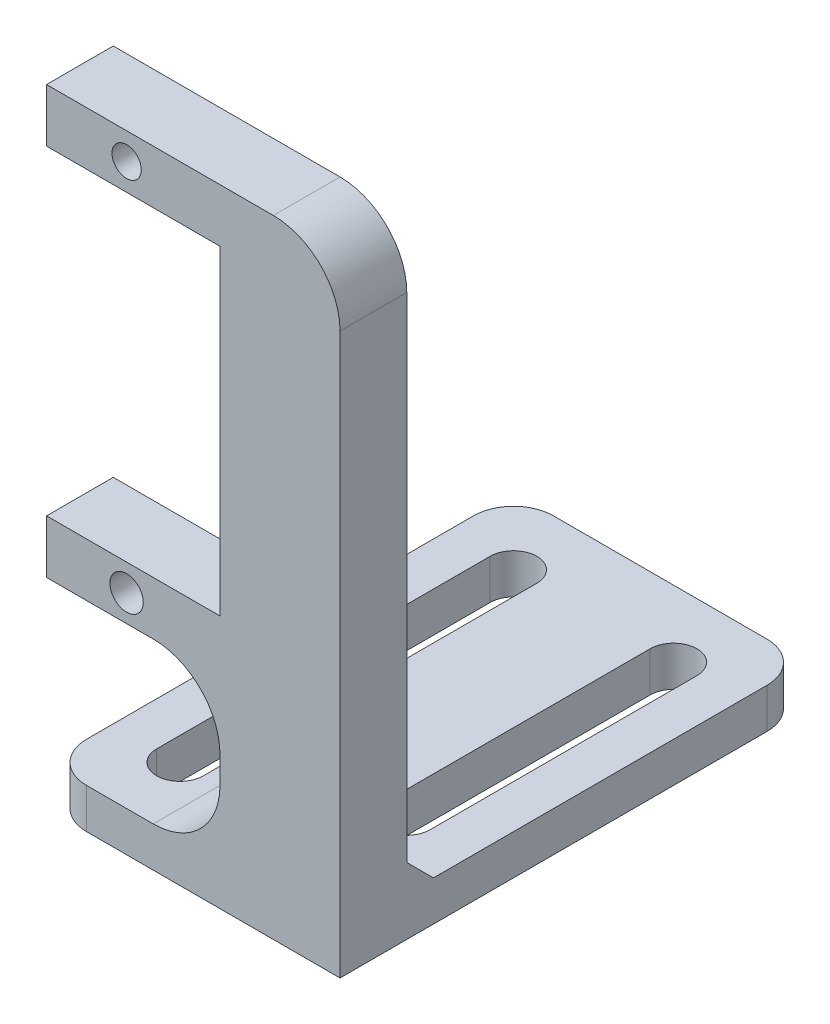
ISO-10303-21;
HEADER;
FILE_DESCRIPTION(('STEP AP214'),'2;1');
FILE_NAME('part.step','',(''),(''),'','','');
FILE_SCHEMA(('AUTOMOTIVE_DESIGN { 1 0 10303 214 1 1 1 1 }'));
ENDSEC;
DATA;
#1=APPLICATION_CONTEXT('core data for automotive mechanical design processes');
#2=APPLICATION_PROTOCOL_DEFINITION('international standard','automotive_design',2000,#1);
#3=PRODUCT_CONTEXT('',#1,'mechanical');
#4=PRODUCT('Part','Part','',(#3));
#5=PRODUCT_RELATED_PRODUCT_CATEGORY('part','',(#4));
#6=PRODUCT_DEFINITION_FORMATION('','',#4);
#7=PRODUCT_DEFINITION_CONTEXT('part definition',#1,'design');
#8=PRODUCT_DEFINITION('design','',#6,#7);
#9=PRODUCT_DEFINITION_SHAPE('','',#8);
#10=(LENGTH_UNIT() NAMED_UNIT(*) SI_UNIT(.MILLI.,.METRE.));
#11=(NAMED_UNIT(*) PLANE_ANGLE_UNIT() SI_UNIT($,.RADIAN.));
#12=(NAMED_UNIT(*) SI_UNIT($,.STERADIAN.) SOLID_ANGLE_UNIT());
#13=UNCERTAINTY_MEASURE_WITH_UNIT(LENGTH_MEASURE(1.E-05),#10,'distance_accuracy_value','');
#14=(GEOMETRIC_REPRESENTATION_CONTEXT(3) GLOBAL_UNCERTAINTY_ASSIGNED_CONTEXT((#13)) GLOBAL_UNIT_ASSIGNED_CONTEXT((#10,
#11,#12)) REPRESENTATION_CONTEXT('',''));
#15=CARTESIAN_POINT('',(0.,0.,0.));
#16=DIRECTION('',(0.,0.,1.));
#17=DIRECTION('',(1.,0.,0.));
#18=AXIS2_PLACEMENT_3D('',#15,#16,#17);
#19=CARTESIAN_POINT('',(16.,0.,2.5));
#20=DIRECTION('',(1.,0.,0.));
#21=DIRECTION('',(0.,1.,0.));
#22=AXIS2_PLACEMENT_3D('',#19,#20,#21);
#23=PLANE('',#22);
#24=DIRECTION('',(0.,-1.,0.));
#25=VECTOR('',#24,1.);
#26=CARTESIAN_POINT('',(16.,0.,-2.5));
#27=LINE('',#26,#25);
#28=CARTESIAN_POINT('',(16.,11.,-2.5));
#29=VERTEX_POINT('',#28);
#30=CARTESIAN_POINT('',(16.,-26.,-2.5));
#31=VERTEX_POINT('',#30);
#32=EDGE_CURVE('E297',#29,#31,#27,.T.);
#33=ORIENTED_EDGE('',*,*,#32,.F.);
#34=DIRECTION('',(0.,0.,-1.));
#35=VECTOR('',#34,1.);
#36=CARTESIAN_POINT('',(16.,11.,2.5));
#37=LINE('',#36,#35);
#38=CARTESIAN_POINT('',(16.,11.,2.5));
#39=VERTEX_POINT('',#38);
#40=EDGE_CURVE('E51',#29,#39,#37,.F.);
#41=ORIENTED_EDGE('',*,*,#40,.T.);
#42=DIRECTION('',(0.,-1.,0.));
#43=VECTOR('',#42,1.);
#44=CARTESIAN_POINT('',(16.,0.,2.5));
#45=LINE('',#44,#43);
#46=CARTESIAN_POINT('',(16.,-31.,2.5));
#47=VERTEX_POINT('',#46);
#48=EDGE_CURVE('E306',#39,#47,#45,.T.);
#49=ORIENTED_EDGE('',*,*,#48,.T.);
#50=DIRECTION('',(0.,0.,1.));
#51=VECTOR('',#50,1.);
#52=CARTESIAN_POINT('',(16.,-31.,-32.5));
#53=LINE('',#52,#51);
#54=CARTESIAN_POINT('',(16.,-31.,-29.5));
#55=VERTEX_POINT('',#54);
#56=EDGE_CURVE('E294',#55,#47,#53,.T.);
#57=ORIENTED_EDGE('',*,*,#56,.F.);
#58=DIRECTION('',(0.,-1.,0.));
#59=VECTOR('',#58,1.);
#60=CARTESIAN_POINT('',(16.,-28.,-29.5));
#61=LINE('',#60,#59);
#62=CARTESIAN_POINT('',(16.,-28.,-29.5));
#63=VERTEX_POINT('',#62);
#64=EDGE_CURVE('E425',#55,#63,#61,.F.);
#65=ORIENTED_EDGE('',*,*,#64,.T.);
#66=DIRECTION('',(0.,0.,1.));
#67=VECTOR('',#66,1.);
#68=CARTESIAN_POINT('',(16.,-28.,-32.5));
#69=LINE('',#68,#67);
#70=CARTESIAN_POINT('',(16.,-28.,-4.5));
#71=VERTEX_POINT('',#70);
#72=EDGE_CURVE('E289',#63,#71,#69,.T.);
#73=ORIENTED_EDGE('',*,*,#72,.T.);
#74=DIRECTION('',(0.,0.707106781186551,0.707106781186544));
#75=VECTOR('',#74,1.);
#76=CARTESIAN_POINT('',(16.,-26.,-2.5));
#77=LINE('',#76,#75);
#78=EDGE_CURVE('E448',#71,#31,#77,.T.);
#79=ORIENTED_EDGE('',*,*,#78,.T.);
#80=EDGE_LOOP('',(#33,#41,#49,#57,#65,#73,#79));
#81=FACE_BOUND('',#80,.T.);
#82=ADVANCED_FACE('F43',(#81),#23,.T.);
#83=CARTESIAN_POINT('',(0.,16.,2.5));
#84=DIRECTION('',(0.,1.,0.));
#85=DIRECTION('',(0.,0.,1.));
#86=AXIS2_PLACEMENT_3D('',#83,#84,#85);
#87=PLANE('',#86);
#88=DIRECTION('',(1.,0.,0.));
#89=VECTOR('',#88,1.);
#90=CARTESIAN_POINT('',(0.,16.,2.5));
#91=LINE('',#90,#89);
#92=CARTESIAN_POINT('',(-6.,16.,2.5));
#93=VERTEX_POINT('',#92);
#94=CARTESIAN_POINT('',(11.,16.,2.5));
#95=VERTEX_POINT('',#94);
#96=EDGE_CURVE('E308',#93,#95,#91,.T.);
#97=ORIENTED_EDGE('',*,*,#96,.T.);
#98=DIRECTION('',(0.,0.,-1.));
#99=VECTOR('',#98,1.);
#100=CARTESIAN_POINT('',(11.,16.,2.5));
#101=LINE('',#100,#99);
#102=CARTESIAN_POINT('',(11.,16.,-2.5));
#103=VERTEX_POINT('',#102);
#104=EDGE_CURVE('E451',#95,#103,#101,.T.);
#105=ORIENTED_EDGE('',*,*,#104,.T.);
#106=DIRECTION('',(1.,0.,0.));
#107=VECTOR('',#106,1.);
#108=CARTESIAN_POINT('',(0.,16.,-2.5));
#109=LINE('',#108,#107);
#110=CARTESIAN_POINT('',(-6.,16.,-2.5));
#111=VERTEX_POINT('',#110);
#112=EDGE_CURVE('E336',#111,#103,#109,.T.);
#113=ORIENTED_EDGE('',*,*,#112,.F.);
#114=DIRECTION('',(0.,0.,-1.));
#115=VECTOR('',#114,1.);
#116=CARTESIAN_POINT('',(-6.,16.,2.5));
#117=LINE('',#116,#115);
#118=EDGE_CURVE('E373',#93,#111,#117,.T.);
#119=ORIENTED_EDGE('',*,*,#118,.F.);
#120=EDGE_LOOP('',(#97,#105,#113,#119));
#121=FACE_BOUND('',#120,.T.);
#122=ADVANCED_FACE('F457',(#121),#87,.T.);
#123=CARTESIAN_POINT('',(-6.,0.,2.5));
#124=DIRECTION('',(1.,0.,0.));
#125=DIRECTION('',(0.,1.,0.));
#126=AXIS2_PLACEMENT_3D('',#123,#124,#125);
#127=PLANE('',#126);
#128=DIRECTION('',(0.,-1.,0.));
#129=VECTOR('',#128,1.);
#130=CARTESIAN_POINT('',(-6.,0.,-2.5));
#131=LINE('',#130,#129);
#132=CARTESIAN_POINT('',(-6.,12.,-2.5));
#133=VERTEX_POINT('',#132);
#134=EDGE_CURVE('E338',#111,#133,#131,.T.);
#135=ORIENTED_EDGE('',*,*,#134,.T.);
#136=DIRECTION('',(0.,0.,-1.));
#137=VECTOR('',#136,1.);
#138=CARTESIAN_POINT('',(-6.,12.,2.5));
#139=LINE('',#138,#137);
#140=CARTESIAN_POINT('',(-6.,12.,2.5));
#141=VERTEX_POINT('',#140);
#142=EDGE_CURVE('E370',#141,#133,#139,.T.);
#143=ORIENTED_EDGE('',*,*,#142,.F.);
#144=DIRECTION('',(0.,-1.,0.));
#145=VECTOR('',#144,1.);
#146=CARTESIAN_POINT('',(-6.,0.,2.5));
#147=LINE('',#146,#145);
#148=EDGE_CURVE('E312',#93,#141,#147,.T.);
#149=ORIENTED_EDGE('',*,*,#148,.F.);
#150=ORIENTED_EDGE('',*,*,#118,.T.);
#151=EDGE_LOOP('',(#135,#143,#149,#150));
#152=FACE_BOUND('',#151,.T.);
#153=ADVANCED_FACE('F468',(#152),#127,.F.);
#154=CARTESIAN_POINT('',(0.,12.,2.5));
#155=DIRECTION('',(0.,1.,0.));
#156=DIRECTION('',(0.,0.,1.));
#157=AXIS2_PLACEMENT_3D('',#154,#155,#156);
#158=PLANE('',#157);
#159=DIRECTION('',(1.,0.,0.));
#160=VECTOR('',#159,1.);
#161=CARTESIAN_POINT('',(0.,12.,-2.5));
#162=LINE('',#161,#160);
#163=CARTESIAN_POINT('',(7.,12.,-2.5));
#164=VERTEX_POINT('',#163);
#165=EDGE_CURVE('E340',#133,#164,#162,.T.);
#166=ORIENTED_EDGE('',*,*,#165,.T.);
#167=DIRECTION('',(0.,0.,-1.));
#168=VECTOR('',#167,1.);
#169=CARTESIAN_POINT('',(7.,12.,2.5));
#170=LINE('',#169,#168);
#171=CARTESIAN_POINT('',(7.,12.,2.5));
#172=VERTEX_POINT('',#171);
#173=EDGE_CURVE('E367',#172,#164,#170,.T.);
#174=ORIENTED_EDGE('',*,*,#173,.F.);
#175=DIRECTION('',(1.,0.,0.));
#176=VECTOR('',#175,1.);
#177=CARTESIAN_POINT('',(0.,12.,2.5));
#178=LINE('',#177,#176);
#179=EDGE_CURVE('E314',#141,#172,#178,.T.);
#180=ORIENTED_EDGE('',*,*,#179,.F.);
#181=ORIENTED_EDGE('',*,*,#142,.T.);
#182=EDGE_LOOP('',(#166,#174,#180,#181));
#183=FACE_BOUND('',#182,.T.);
#184=ADVANCED_FACE('F472',(#183),#158,.F.);
#185=CARTESIAN_POINT('',(7.,0.,2.5));
#186=DIRECTION('',(1.,0.,0.));
#187=DIRECTION('',(0.,1.,0.));
#188=AXIS2_PLACEMENT_3D('',#185,#186,#187);
#189=PLANE('',#188);
#190=DIRECTION('',(0.,-1.,0.));
#191=VECTOR('',#190,1.);
#192=CARTESIAN_POINT('',(7.,0.,-2.5));
#193=LINE('',#192,#191);
#194=CARTESIAN_POINT('',(7.,-12.,-2.5));
#195=VERTEX_POINT('',#194);
#196=EDGE_CURVE('E342',#164,#195,#193,.T.);
#197=ORIENTED_EDGE('',*,*,#196,.T.);
#198=DIRECTION('',(0.,0.,-1.));
#199=VECTOR('',#198,1.);
#200=CARTESIAN_POINT('',(7.,-12.,2.5));
#201=LINE('',#200,#199);
#202=CARTESIAN_POINT('',(7.,-12.,2.5));
#203=VERTEX_POINT('',#202);
#204=EDGE_CURVE('E364',#203,#195,#201,.T.);
#205=ORIENTED_EDGE('',*,*,#204,.F.);
#206=DIRECTION('',(0.,-1.,0.));
#207=VECTOR('',#206,1.);
#208=CARTESIAN_POINT('',(7.,0.,2.5));
#209=LINE('',#208,#207);
#210=EDGE_CURVE('E316',#172,#203,#209,.T.);
#211=ORIENTED_EDGE('',*,*,#210,.F.);
#212=ORIENTED_EDGE('',*,*,#173,.T.);
#213=EDGE_LOOP('',(#197,#205,#211,#212));
#214=FACE_BOUND('',#213,.T.);
#215=ADVANCED_FACE('F564',(#214),#189,.F.);
#216=CARTESIAN_POINT('',(0.,-12.,2.5));
#217=DIRECTION('',(0.,-1.,0.));
#218=DIRECTION('',(0.,0.,-1.));
#219=AXIS2_PLACEMENT_3D('',#216,#217,#218);
#220=PLANE('',#219);
#221=DIRECTION('',(-1.,0.,0.));
#222=VECTOR('',#221,1.);
#223=CARTESIAN_POINT('',(0.,-12.,-2.5));
#224=LINE('',#223,#222);
#225=CARTESIAN_POINT('',(-6.,-12.,-2.5));
#226=VERTEX_POINT('',#225);
#227=EDGE_CURVE('E344',#195,#226,#224,.T.);
#228=ORIENTED_EDGE('',*,*,#227,.T.);
#229=DIRECTION('',(0.,0.,-1.));
#230=VECTOR('',#229,1.);
#231=CARTESIAN_POINT('',(-6.,-12.,2.5));
#232=LINE('',#231,#230);
#233=CARTESIAN_POINT('',(-6.,-12.,2.5));
#234=VERTEX_POINT('',#233);
#235=EDGE_CURVE('E361',#234,#226,#232,.T.);
#236=ORIENTED_EDGE('',*,*,#235,.F.);
#237=DIRECTION('',(-1.,0.,0.));
#238=VECTOR('',#237,1.);
#239=CARTESIAN_POINT('',(0.,-12.,2.5));
#240=LINE('',#239,#238);
#241=EDGE_CURVE('E318',#203,#234,#240,.T.);
#242=ORIENTED_EDGE('',*,*,#241,.F.);
#243=ORIENTED_EDGE('',*,*,#204,.T.);
#244=EDGE_LOOP('',(#228,#236,#242,#243));
#245=FACE_BOUND('',#244,.T.);
#246=ADVANCED_FACE('F561',(#245),#220,.F.);
#247=CARTESIAN_POINT('',(-6.,0.,2.5));
#248=DIRECTION('',(1.,0.,0.));
#249=DIRECTION('',(0.,1.,0.));
#250=AXIS2_PLACEMENT_3D('',#247,#248,#249);
#251=PLANE('',#250);
#252=DIRECTION('',(0.,-1.,0.));
#253=VECTOR('',#252,1.);
#254=CARTESIAN_POINT('',(-6.,0.,-2.5));
#255=LINE('',#254,#253);
#256=CARTESIAN_POINT('',(-6.,-16.,-2.5));
#257=VERTEX_POINT('',#256);
#258=EDGE_CURVE('E346',#226,#257,#255,.T.);
#259=ORIENTED_EDGE('',*,*,#258,.T.);
#260=DIRECTION('',(0.,0.,-1.));
#261=VECTOR('',#260,1.);
#262=CARTESIAN_POINT('',(-6.,-16.,2.5));
#263=LINE('',#262,#261);
#264=CARTESIAN_POINT('',(-6.,-16.,2.5));
#265=VERTEX_POINT('',#264);
#266=EDGE_CURVE('E334',#265,#257,#263,.T.);
#267=ORIENTED_EDGE('',*,*,#266,.F.);
#268=DIRECTION('',(0.,-1.,0.));
#269=VECTOR('',#268,1.);
#270=CARTESIAN_POINT('',(-6.,0.,2.5));
#271=LINE('',#270,#269);
#272=EDGE_CURVE('E320',#234,#265,#271,.T.);
#273=ORIENTED_EDGE('',*,*,#272,.F.);
#274=ORIENTED_EDGE('',*,*,#235,.T.);
#275=EDGE_LOOP('',(#259,#267,#273,#274));
#276=FACE_BOUND('',#275,.T.);
#277=ADVANCED_FACE('F557',(#276),#251,.F.);
#278=CARTESIAN_POINT('',(0.,-16.,2.5));
#279=DIRECTION('',(0.,1.,0.));
#280=DIRECTION('',(0.,0.,1.));
#281=AXIS2_PLACEMENT_3D('',#278,#279,#280);
#282=PLANE('',#281);
#283=DIRECTION('',(1.,0.,0.));
#284=VECTOR('',#283,1.);
#285=CARTESIAN_POINT('',(0.,-16.,-2.5));
#286=LINE('',#285,#284);
#287=CARTESIAN_POINT('',(2.00000000000001,-16.,-2.5));
#288=VERTEX_POINT('',#287);
#289=EDGE_CURVE('E348',#257,#288,#286,.T.);
#290=ORIENTED_EDGE('',*,*,#289,.T.);
#291=DIRECTION('',(0.,0.,-1.));
#292=VECTOR('',#291,1.);
#293=CARTESIAN_POINT('',(2.00000000000001,-16.,2.5));
#294=LINE('',#293,#292);
#295=CARTESIAN_POINT('',(2.00000000000001,-16.,2.5));
#296=VERTEX_POINT('',#295);
#297=EDGE_CURVE('E403',#288,#296,#294,.F.);
#298=ORIENTED_EDGE('',*,*,#297,.T.);
#299=DIRECTION('',(1.,0.,0.));
#300=VECTOR('',#299,1.);
#301=CARTESIAN_POINT('',(0.,-16.,2.5));
#302=LINE('',#301,#300);
#303=EDGE_CURVE('E322',#265,#296,#302,.T.);
#304=ORIENTED_EDGE('',*,*,#303,.F.);
#305=ORIENTED_EDGE('',*,*,#266,.T.);
#306=EDGE_LOOP('',(#290,#298,#304,#305));
#307=FACE_BOUND('',#306,.T.);
#308=ADVANCED_FACE('F553',(#307),#282,.F.);
#309=CARTESIAN_POINT('',(0.,-14.,2.5));
#310=DIRECTION('',(0.,0.,-1.));
#311=DIRECTION('',(-1.,0.,0.));
#312=AXIS2_PLACEMENT_3D('',#309,#310,#311);
#313=CYLINDRICAL_SURFACE('',#312,1.25);
#314=CARTESIAN_POINT('',(0.,-14.,2.5));
#315=DIRECTION('',(0.,0.,1.));
#316=DIRECTION('',(1.,0.,0.));
#317=AXIS2_PLACEMENT_3D('',#314,#315,#316);
#318=CIRCLE('',#317,1.25);
#319=CARTESIAN_POINT('',(1.25,-14.,2.5));
#320=VERTEX_POINT('',#319);
#321=EDGE_CURVE('E328',#320,#320,#318,.T.);
#322=ORIENTED_EDGE('',*,*,#321,.T.);
#323=EDGE_LOOP('',(#322));
#324=FACE_BOUND('',#323,.T.);
#325=CARTESIAN_POINT('',(0.,-14.,-2.5));
#326=DIRECTION('',(0.,0.,1.));
#327=DIRECTION('',(1.,0.,0.));
#328=AXIS2_PLACEMENT_3D('',#325,#326,#327);
#329=CIRCLE('',#328,1.25);
#330=CARTESIAN_POINT('',(1.25,-14.,-2.5));
#331=VERTEX_POINT('',#330);
#332=EDGE_CURVE('E354',#331,#331,#329,.T.);
#333=ORIENTED_EDGE('',*,*,#332,.F.);
#334=EDGE_LOOP('',(#333));
#335=FACE_BOUND('',#334,.T.);
#336=ADVANCED_FACE('F610',(#324,#335),#313,.F.);
#337=CARTESIAN_POINT('',(7.,0.,2.5));
#338=DIRECTION('',(1.,0.,0.));
#339=DIRECTION('',(0.,1.,0.));
#340=AXIS2_PLACEMENT_3D('',#337,#338,#339);
#341=PLANE('',#340);
#342=DIRECTION('',(0.,-1.,0.));
#343=VECTOR('',#342,1.);
#344=CARTESIAN_POINT('',(7.,0.,-2.5));
#345=LINE('',#344,#343);
#346=CARTESIAN_POINT('',(7.00000000000001,-21.,-2.5));
#347=VERTEX_POINT('',#346);
#348=CARTESIAN_POINT('',(7.00000000000001,-23.,-2.5));
#349=VERTEX_POINT('',#348);
#350=EDGE_CURVE('E351',#347,#349,#345,.T.);
#351=ORIENTED_EDGE('',*,*,#350,.T.);
#352=DIRECTION('',(0.,0.,-1.));
#353=VECTOR('',#352,1.);
#354=CARTESIAN_POINT('',(7.00000000000001,-23.,2.5));
#355=LINE('',#354,#353);
#356=CARTESIAN_POINT('',(7.00000000000001,-23.,2.5));
#357=VERTEX_POINT('',#356);
#358=EDGE_CURVE('E401',#349,#357,#355,.F.);
#359=ORIENTED_EDGE('',*,*,#358,.T.);
#360=DIRECTION('',(0.,-1.,0.));
#361=VECTOR('',#360,1.);
#362=CARTESIAN_POINT('',(7.,0.,2.5));
#363=LINE('',#362,#361);
#364=CARTESIAN_POINT('',(7.00000000000001,-21.,2.5));
#365=VERTEX_POINT('',#364);
#366=EDGE_CURVE('E325',#365,#357,#363,.T.);
#367=ORIENTED_EDGE('',*,*,#366,.F.);
#368=DIRECTION('',(0.,0.,-1.));
#369=VECTOR('',#368,1.);
#370=CARTESIAN_POINT('',(7.00000000000001,-21.,-2.5));
#371=LINE('',#370,#369);
#372=EDGE_CURVE('E398',#365,#347,#371,.T.);
#373=ORIENTED_EDGE('',*,*,#372,.T.);
#374=EDGE_LOOP('',(#351,#359,#367,#373));
#375=FACE_BOUND('',#374,.T.);
#376=ADVANCED_FACE('F545',(#375),#341,.F.);
#377=CARTESIAN_POINT('',(0.,14.,2.5));
#378=DIRECTION('',(0.,0.,-1.));
#379=DIRECTION('',(-1.,0.,0.));
#380=AXIS2_PLACEMENT_3D('',#377,#378,#379);
#381=CYLINDRICAL_SURFACE('',#380,1.1);
#382=CARTESIAN_POINT('',(0.,14.,2.5));
#383=DIRECTION('',(0.,0.,1.));
#384=DIRECTION('',(1.,0.,0.));
#385=AXIS2_PLACEMENT_3D('',#382,#383,#384);
#386=CIRCLE('',#385,1.1);
#387=CARTESIAN_POINT('',(1.09999999999999,14.,2.5));
#388=VERTEX_POINT('',#387);
#389=EDGE_CURVE('E331',#388,#388,#386,.T.);
#390=ORIENTED_EDGE('',*,*,#389,.T.);
#391=EDGE_LOOP('',(#390));
#392=FACE_BOUND('',#391,.T.);
#393=CARTESIAN_POINT('',(0.,14.,-2.5));
#394=DIRECTION('',(0.,0.,1.));
#395=DIRECTION('',(1.,0.,0.));
#396=AXIS2_PLACEMENT_3D('',#393,#394,#395);
#397=CIRCLE('',#396,1.1);
#398=CARTESIAN_POINT('',(1.09999999999999,14.,-2.5));
#399=VERTEX_POINT('',#398);
#400=EDGE_CURVE('E309',#399,#399,#397,.T.);
#401=ORIENTED_EDGE('',*,*,#400,.F.);
#402=EDGE_LOOP('',(#401));
#403=FACE_BOUND('',#402,.T.);
#404=ADVANCED_FACE('F629',(#392,#403),#381,.F.);
#405=CARTESIAN_POINT('',(0.,0.,2.5));
#406=DIRECTION('',(0.,0.,1.));
#407=DIRECTION('',(1.,0.,0.));
#408=AXIS2_PLACEMENT_3D('',#405,#406,#407);
#409=PLANE('',#408);
#410=ORIENTED_EDGE('',*,*,#48,.F.);
#411=CARTESIAN_POINT('',(11.,11.,2.5));
#412=DIRECTION('',(0.,0.,1.));
#413=DIRECTION('',(1.,0.,0.));
#414=AXIS2_PLACEMENT_3D('',#411,#412,#413);
#415=CIRCLE('',#414,5.);
#416=EDGE_CURVE('E11',#39,#95,#415,.T.);
#417=ORIENTED_EDGE('',*,*,#416,.T.);
#418=ORIENTED_EDGE('',*,*,#96,.F.);
#419=ORIENTED_EDGE('',*,*,#148,.T.);
#420=ORIENTED_EDGE('',*,*,#179,.T.);
#421=ORIENTED_EDGE('',*,*,#210,.T.);
#422=ORIENTED_EDGE('',*,*,#241,.T.);
#423=ORIENTED_EDGE('',*,*,#272,.T.);
#424=ORIENTED_EDGE('',*,*,#303,.T.);
#425=CARTESIAN_POINT('',(2.00000000000001,-21.,2.5));
#426=DIRECTION('',(0.,0.,1.));
#427=DIRECTION('',(1.,0.,0.));
#428=AXIS2_PLACEMENT_3D('',#425,#426,#427);
#429=CIRCLE('',#428,5.);
#430=EDGE_CURVE('E411',#296,#365,#429,.F.);
#431=ORIENTED_EDGE('',*,*,#430,.T.);
#432=ORIENTED_EDGE('',*,*,#366,.T.);
#433=CARTESIAN_POINT('',(2.00000000000001,-23.,2.5));
#434=DIRECTION('',(0.,0.,1.));
#435=DIRECTION('',(1.,0.,0.));
#436=AXIS2_PLACEMENT_3D('',#433,#434,#435);
#437=CIRCLE('',#436,5.);
#438=CARTESIAN_POINT('',(2.00000000000001,-28.,2.5));
#439=VERTEX_POINT('',#438);
#440=EDGE_CURVE('E407',#357,#439,#437,.F.);
#441=ORIENTED_EDGE('',*,*,#440,.T.);
#442=DIRECTION('',(-1.,0.,0.));
#443=VECTOR('',#442,1.);
#444=CARTESIAN_POINT('',(0.,-28.,2.5));
#445=LINE('',#444,#443);
#446=CARTESIAN_POINT('',(-3.,-28.,2.5));
#447=VERTEX_POINT('',#446);
#448=EDGE_CURVE('E259',#439,#447,#445,.T.);
#449=ORIENTED_EDGE('',*,*,#448,.T.);
#450=DIRECTION('',(0.,1.,0.));
#451=VECTOR('',#450,1.);
#452=CARTESIAN_POINT('',(-3.,-31.,2.5));
#453=LINE('',#452,#451);
#454=CARTESIAN_POINT('',(-3.,-31.,2.5));
#455=VERTEX_POINT('',#454);
#456=EDGE_CURVE('E438',#447,#455,#453,.F.);
#457=ORIENTED_EDGE('',*,*,#456,.T.);
#458=DIRECTION('',(-1.,0.,0.));
#459=VECTOR('',#458,1.);
#460=CARTESIAN_POINT('',(0.,-31.,2.5));
#461=LINE('',#460,#459);
#462=EDGE_CURVE('E286',#47,#455,#461,.T.);
#463=ORIENTED_EDGE('',*,*,#462,.F.);
#464=EDGE_LOOP('',(#410,#417,#418,#419,#420,#421,#422,#423,#424,#431,#432,#441,#449,#457,#463));
#465=FACE_BOUND('',#464,.T.);
#466=ORIENTED_EDGE('',*,*,#321,.F.);
#467=EDGE_LOOP('',(#466));
#468=FACE_BOUND('',#467,.T.);
#469=ORIENTED_EDGE('',*,*,#389,.F.);
#470=EDGE_LOOP('',(#469));
#471=FACE_BOUND('',#470,.T.);
#472=ADVANCED_FACE('F476',(#465,#468,#471),#409,.T.);
#473=CARTESIAN_POINT('',(0.,0.,-2.5));
#474=DIRECTION('',(0.,0.,1.));
#475=DIRECTION('',(1.,0.,0.));
#476=AXIS2_PLACEMENT_3D('',#473,#474,#475);
#477=PLANE('',#476);
#478=ORIENTED_EDGE('',*,*,#112,.T.);
#479=CARTESIAN_POINT('',(11.,11.,-2.5));
#480=DIRECTION('',(0.,0.,1.));
#481=DIRECTION('',(1.,0.,0.));
#482=AXIS2_PLACEMENT_3D('',#479,#480,#481);
#483=CIRCLE('',#482,5.);
#484=EDGE_CURVE('E65',#103,#29,#483,.F.);
#485=ORIENTED_EDGE('',*,*,#484,.T.);
#486=ORIENTED_EDGE('',*,*,#32,.T.);
#487=DIRECTION('',(-1.,0.,0.));
#488=VECTOR('',#487,1.);
#489=CARTESIAN_POINT('',(0.,-26.,-2.5));
#490=LINE('',#489,#488);
#491=CARTESIAN_POINT('',(6.00000000000002,-26.,-2.5));
#492=VERTEX_POINT('',#491);
#493=EDGE_CURVE('E440',#31,#492,#490,.T.);
#494=ORIENTED_EDGE('',*,*,#493,.T.);
#495=CARTESIAN_POINT('',(2.00000000000001,-23.,-2.5));
#496=DIRECTION('',(0.,0.,1.));
#497=DIRECTION('',(1.,0.,0.));
#498=AXIS2_PLACEMENT_3D('',#495,#496,#497);
#499=CIRCLE('',#498,5.);
#500=EDGE_CURVE('E405',#492,#349,#499,.T.);
#501=ORIENTED_EDGE('',*,*,#500,.T.);
#502=ORIENTED_EDGE('',*,*,#350,.F.);
#503=CARTESIAN_POINT('',(2.00000000000001,-21.,-2.5));
#504=DIRECTION('',(0.,0.,1.));
#505=DIRECTION('',(1.,0.,0.));
#506=AXIS2_PLACEMENT_3D('',#503,#504,#505);
#507=CIRCLE('',#506,5.);
#508=EDGE_CURVE('E409',#347,#288,#507,.T.);
#509=ORIENTED_EDGE('',*,*,#508,.T.);
#510=ORIENTED_EDGE('',*,*,#289,.F.);
#511=ORIENTED_EDGE('',*,*,#258,.F.);
#512=ORIENTED_EDGE('',*,*,#227,.F.);
#513=ORIENTED_EDGE('',*,*,#196,.F.);
#514=ORIENTED_EDGE('',*,*,#165,.F.);
#515=ORIENTED_EDGE('',*,*,#134,.F.);
#516=EDGE_LOOP('',(#478,#485,#486,#494,#501,#502,#509,#510,#511,#512,#513,#514,#515));
#517=FACE_BOUND('',#516,.T.);
#518=ORIENTED_EDGE('',*,*,#332,.T.);
#519=EDGE_LOOP('',(#518));
#520=FACE_BOUND('',#519,.T.);
#521=ORIENTED_EDGE('',*,*,#400,.T.);
#522=EDGE_LOOP('',(#521));
#523=FACE_BOUND('',#522,.T.);
#524=ADVANCED_FACE('F462',(#517,#520,#523),#477,.F.);
#525=CARTESIAN_POINT('',(0.,-28.,-32.5));
#526=DIRECTION('',(0.,1.,0.));
#527=DIRECTION('',(0.,0.,1.));
#528=AXIS2_PLACEMENT_3D('',#525,#526,#527);
#529=PLANE('',#528);
#530=DIRECTION('',(0.,0.,1.));
#531=VECTOR('',#530,1.);
#532=CARTESIAN_POINT('',(-2.75,-28.,0.));
#533=LINE('',#532,#531);
#534=CARTESIAN_POINT('',(-2.75,-28.,-27.5));
#535=VERTEX_POINT('',#534);
#536=CARTESIAN_POINT('',(-2.75,-28.,-2.5));
#537=VERTEX_POINT('',#536);
#538=EDGE_CURVE('E247',#535,#537,#533,.T.);
#539=ORIENTED_EDGE('',*,*,#538,.F.);
#540=CARTESIAN_POINT('',(-1.,-28.,-27.5));
#541=DIRECTION('',(0.,1.,0.));
#542=DIRECTION('',(0.,0.,1.));
#543=AXIS2_PLACEMENT_3D('',#540,#541,#542);
#544=CIRCLE('',#543,1.75);
#545=CARTESIAN_POINT('',(0.750000000000001,-28.,-27.5));
#546=VERTEX_POINT('',#545);
#547=EDGE_CURVE('E252',#546,#535,#544,.T.);
#548=ORIENTED_EDGE('',*,*,#547,.F.);
#549=DIRECTION('',(0.,0.,-1.));
#550=VECTOR('',#549,1.);
#551=CARTESIAN_POINT('',(0.750000000000004,-28.,0.));
#552=LINE('',#551,#550);
#553=CARTESIAN_POINT('',(0.750000000000003,-28.,-2.5));
#554=VERTEX_POINT('',#553);
#555=EDGE_CURVE('E231',#554,#546,#552,.T.);
#556=ORIENTED_EDGE('',*,*,#555,.F.);
#557=CARTESIAN_POINT('',(-0.999999999999996,-28.,-2.5));
#558=DIRECTION('',(0.,1.,0.));
#559=DIRECTION('',(0.,0.,1.));
#560=AXIS2_PLACEMENT_3D('',#557,#558,#559);
#561=CIRCLE('',#560,1.75);
#562=EDGE_CURVE('E242',#537,#554,#561,.T.);
#563=ORIENTED_EDGE('',*,*,#562,.F.);
#564=EDGE_LOOP('',(#539,#548,#556,#563));
#565=FACE_BOUND('',#564,.T.);
#566=CARTESIAN_POINT('',(11.,-28.,-7.5));
#567=DIRECTION('',(0.,1.,0.));
#568=DIRECTION('',(0.,0.,1.));
#569=AXIS2_PLACEMENT_3D('',#566,#567,#568);
#570=CIRCLE('',#569,1.75);
#571=CARTESIAN_POINT('',(9.25000000000002,-28.,-7.5));
#572=VERTEX_POINT('',#571);
#573=CARTESIAN_POINT('',(12.75,-28.,-7.5));
#574=VERTEX_POINT('',#573);
#575=EDGE_CURVE('E262',#572,#574,#570,.T.);
#576=ORIENTED_EDGE('',*,*,#575,.F.);
#577=DIRECTION('',(0.,0.,1.));
#578=VECTOR('',#577,1.);
#579=CARTESIAN_POINT('',(9.25000000000002,-28.,0.));
#580=LINE('',#579,#578);
#581=CARTESIAN_POINT('',(9.25000000000001,-28.,-27.5));
#582=VERTEX_POINT('',#581);
#583=EDGE_CURVE('E270',#582,#572,#580,.T.);
#584=ORIENTED_EDGE('',*,*,#583,.F.);
#585=CARTESIAN_POINT('',(11.,-28.,-27.5));
#586=DIRECTION('',(0.,1.,0.));
#587=DIRECTION('',(0.,0.,1.));
#588=AXIS2_PLACEMENT_3D('',#585,#586,#587);
#589=CIRCLE('',#588,1.75);
#590=CARTESIAN_POINT('',(12.75,-28.,-27.5));
#591=VERTEX_POINT('',#590);
#592=EDGE_CURVE('E267',#591,#582,#589,.T.);
#593=ORIENTED_EDGE('',*,*,#592,.F.);
#594=DIRECTION('',(0.,0.,-1.));
#595=VECTOR('',#594,1.);
#596=CARTESIAN_POINT('',(12.75,-28.,0.));
#597=LINE('',#596,#595);
#598=EDGE_CURVE('E264',#574,#591,#597,.T.);
#599=ORIENTED_EDGE('',*,*,#598,.F.);
#600=EDGE_LOOP('',(#576,#584,#593,#599));
#601=FACE_BOUND('',#600,.T.);
#602=DIRECTION('',(0.,0.,-1.));
#603=VECTOR('',#602,1.);
#604=CARTESIAN_POINT('',(2.00000000000001,-28.,-32.5));
#605=LINE('',#604,#603);
#606=CARTESIAN_POINT('',(2.00000000000001,-28.,-4.5));
#607=VERTEX_POINT('',#606);
#608=EDGE_CURVE('E396',#439,#607,#605,.T.);
#609=ORIENTED_EDGE('',*,*,#608,.T.);
#610=DIRECTION('',(1.,0.,0.));
#611=VECTOR('',#610,1.);
#612=CARTESIAN_POINT('',(0.,-28.,-4.5));
#613=LINE('',#612,#611);
#614=EDGE_CURVE('E443',#607,#71,#613,.T.);
#615=ORIENTED_EDGE('',*,*,#614,.T.);
#616=ORIENTED_EDGE('',*,*,#72,.F.);
#617=CARTESIAN_POINT('',(13.,-28.,-29.5));
#618=DIRECTION('',(0.,1.,0.));
#619=DIRECTION('',(0.,0.,1.));
#620=AXIS2_PLACEMENT_3D('',#617,#618,#619);
#621=CIRCLE('',#620,3.);
#622=CARTESIAN_POINT('',(13.,-28.,-32.5));
#623=VERTEX_POINT('',#622);
#624=EDGE_CURVE('E431',#63,#623,#621,.T.);
#625=ORIENTED_EDGE('',*,*,#624,.T.);
#626=DIRECTION('',(-1.,0.,0.));
#627=VECTOR('',#626,1.);
#628=CARTESIAN_POINT('',(0.,-28.,-32.5));
#629=LINE('',#628,#627);
#630=CARTESIAN_POINT('',(-3.,-28.,-32.5));
#631=VERTEX_POINT('',#630);
#632=EDGE_CURVE('E282',#623,#631,#629,.T.);
#633=ORIENTED_EDGE('',*,*,#632,.T.);
#634=CARTESIAN_POINT('',(-3.,-28.,-29.5));
#635=DIRECTION('',(0.,1.,0.));
#636=DIRECTION('',(0.,0.,1.));
#637=AXIS2_PLACEMENT_3D('',#634,#635,#636);
#638=CIRCLE('',#637,3.);
#639=CARTESIAN_POINT('',(-6.,-28.,-29.5));
#640=VERTEX_POINT('',#639);
#641=EDGE_CURVE('E427',#631,#640,#638,.T.);
#642=ORIENTED_EDGE('',*,*,#641,.T.);
#643=DIRECTION('',(0.,0.,1.));
#644=VECTOR('',#643,1.);
#645=CARTESIAN_POINT('',(-6.,-28.,-32.5));
#646=LINE('',#645,#644);
#647=CARTESIAN_POINT('',(-6.,-28.,-0.5));
#648=VERTEX_POINT('',#647);
#649=EDGE_CURVE('E301',#640,#648,#646,.T.);
#650=ORIENTED_EDGE('',*,*,#649,.T.);
#651=CARTESIAN_POINT('',(-3.,-28.,-0.5));
#652=DIRECTION('',(0.,1.,0.));
#653=DIRECTION('',(0.,0.,1.));
#654=AXIS2_PLACEMENT_3D('',#651,#652,#653);
#655=CIRCLE('',#654,3.);
#656=EDGE_CURVE('E429',#648,#447,#655,.T.);
#657=ORIENTED_EDGE('',*,*,#656,.T.);
#658=ORIENTED_EDGE('',*,*,#448,.F.);
#659=EDGE_LOOP('',(#609,#615,#616,#625,#633,#642,#650,#657,#658));
#660=FACE_BOUND('',#659,.T.);
#661=ADVANCED_FACE('F249',(#565,#601,#660),#529,.T.);
#662=CARTESIAN_POINT('',(0.,-31.,-32.5));
#663=DIRECTION('',(0.,1.,0.));
#664=DIRECTION('',(0.,0.,1.));
#665=AXIS2_PLACEMENT_3D('',#662,#663,#664);
#666=PLANE('',#665);
#667=CARTESIAN_POINT('',(-1.,-31.,-27.5));
#668=DIRECTION('',(0.,1.,0.));
#669=DIRECTION('',(0.,0.,1.));
#670=AXIS2_PLACEMENT_3D('',#667,#668,#669);
#671=CIRCLE('',#670,1.75);
#672=CARTESIAN_POINT('',(0.750000000000001,-31.,-27.5));
#673=VERTEX_POINT('',#672);
#674=CARTESIAN_POINT('',(-2.75,-31.,-27.5));
#675=VERTEX_POINT('',#674);
#676=EDGE_CURVE('E390',#673,#675,#671,.T.);
#677=ORIENTED_EDGE('',*,*,#676,.T.);
#678=DIRECTION('',(0.,0.,1.));
#679=VECTOR('',#678,1.);
#680=CARTESIAN_POINT('',(-2.75,-31.,-32.5));
#681=LINE('',#680,#679);
#682=CARTESIAN_POINT('',(-2.75,-31.,-2.5));
#683=VERTEX_POINT('',#682);
#684=EDGE_CURVE('E393',#675,#683,#681,.T.);
#685=ORIENTED_EDGE('',*,*,#684,.T.);
#686=CARTESIAN_POINT('',(-0.999999999999996,-31.,-2.5));
#687=DIRECTION('',(0.,1.,0.));
#688=DIRECTION('',(0.,0.,1.));
#689=AXIS2_PLACEMENT_3D('',#686,#687,#688);
#690=CIRCLE('',#689,1.75);
#691=CARTESIAN_POINT('',(0.750000000000003,-31.,-2.5));
#692=VERTEX_POINT('',#691);
#693=EDGE_CURVE('E387',#683,#692,#690,.T.);
#694=ORIENTED_EDGE('',*,*,#693,.T.);
#695=DIRECTION('',(0.,0.,-1.));
#696=VECTOR('',#695,1.);
#697=CARTESIAN_POINT('',(0.75,-31.,-32.5));
#698=LINE('',#697,#696);
#699=EDGE_CURVE('E234',#692,#673,#698,.T.);
#700=ORIENTED_EDGE('',*,*,#699,.T.);
#701=EDGE_LOOP('',(#677,#685,#694,#700));
#702=FACE_BOUND('',#701,.T.);
#703=DIRECTION('',(0.,0.,1.));
#704=VECTOR('',#703,1.);
#705=CARTESIAN_POINT('',(9.25000000000001,-31.,-32.5));
#706=LINE('',#705,#704);
#707=CARTESIAN_POINT('',(9.25000000000001,-31.,-27.5));
#708=VERTEX_POINT('',#707);
#709=CARTESIAN_POINT('',(9.25000000000002,-31.,-7.5));
#710=VERTEX_POINT('',#709);
#711=EDGE_CURVE('E381',#708,#710,#706,.T.);
#712=ORIENTED_EDGE('',*,*,#711,.T.);
#713=CARTESIAN_POINT('',(11.,-31.,-7.5));
#714=DIRECTION('',(0.,1.,0.));
#715=DIRECTION('',(0.,0.,1.));
#716=AXIS2_PLACEMENT_3D('',#713,#714,#715);
#717=CIRCLE('',#716,1.75);
#718=CARTESIAN_POINT('',(12.75,-31.,-7.5));
#719=VERTEX_POINT('',#718);
#720=EDGE_CURVE('E384',#710,#719,#717,.T.);
#721=ORIENTED_EDGE('',*,*,#720,.T.);
#722=DIRECTION('',(0.,0.,-1.));
#723=VECTOR('',#722,1.);
#724=CARTESIAN_POINT('',(12.75,-31.,-32.5));
#725=LINE('',#724,#723);
#726=CARTESIAN_POINT('',(12.75,-31.,-27.5));
#727=VERTEX_POINT('',#726);
#728=EDGE_CURVE('E375',#719,#727,#725,.T.);
#729=ORIENTED_EDGE('',*,*,#728,.T.);
#730=CARTESIAN_POINT('',(11.,-31.,-27.5));
#731=DIRECTION('',(0.,1.,0.));
#732=DIRECTION('',(0.,0.,1.));
#733=AXIS2_PLACEMENT_3D('',#730,#731,#732);
#734=CIRCLE('',#733,1.75);
#735=EDGE_CURVE('E378',#727,#708,#734,.T.);
#736=ORIENTED_EDGE('',*,*,#735,.T.);
#737=EDGE_LOOP('',(#712,#721,#729,#736));
#738=FACE_BOUND('',#737,.T.);
#739=DIRECTION('',(-1.,0.,0.));
#740=VECTOR('',#739,1.);
#741=CARTESIAN_POINT('',(0.,-31.,-32.5));
#742=LINE('',#741,#740);
#743=CARTESIAN_POINT('',(13.,-31.,-32.5));
#744=VERTEX_POINT('',#743);
#745=CARTESIAN_POINT('',(-3.,-31.,-32.5));
#746=VERTEX_POINT('',#745);
#747=EDGE_CURVE('E285',#744,#746,#742,.T.);
#748=ORIENTED_EDGE('',*,*,#747,.F.);
#749=CARTESIAN_POINT('',(13.,-31.,-29.5));
#750=DIRECTION('',(0.,1.,0.));
#751=DIRECTION('',(0.,0.,1.));
#752=AXIS2_PLACEMENT_3D('',#749,#750,#751);
#753=CIRCLE('',#752,3.);
#754=EDGE_CURVE('E423',#744,#55,#753,.F.);
#755=ORIENTED_EDGE('',*,*,#754,.T.);
#756=ORIENTED_EDGE('',*,*,#56,.T.);
#757=ORIENTED_EDGE('',*,*,#462,.T.);
#758=CARTESIAN_POINT('',(-3.,-31.,-0.5));
#759=DIRECTION('',(0.,1.,0.));
#760=DIRECTION('',(0.,0.,1.));
#761=AXIS2_PLACEMENT_3D('',#758,#759,#760);
#762=CIRCLE('',#761,3.);
#763=CARTESIAN_POINT('',(-6.,-31.,-0.5));
#764=VERTEX_POINT('',#763);
#765=EDGE_CURVE('E421',#455,#764,#762,.F.);
#766=ORIENTED_EDGE('',*,*,#765,.T.);
#767=DIRECTION('',(0.,0.,1.));
#768=VECTOR('',#767,1.);
#769=CARTESIAN_POINT('',(-6.,-31.,-32.5));
#770=LINE('',#769,#768);
#771=CARTESIAN_POINT('',(-6.,-31.,-29.5));
#772=VERTEX_POINT('',#771);
#773=EDGE_CURVE('E298',#772,#764,#770,.T.);
#774=ORIENTED_EDGE('',*,*,#773,.F.);
#775=CARTESIAN_POINT('',(-3.,-31.,-29.5));
#776=DIRECTION('',(0.,1.,0.));
#777=DIRECTION('',(0.,0.,1.));
#778=AXIS2_PLACEMENT_3D('',#775,#776,#777);
#779=CIRCLE('',#778,3.);
#780=EDGE_CURVE('E419',#772,#746,#779,.F.);
#781=ORIENTED_EDGE('',*,*,#780,.T.);
#782=EDGE_LOOP('',(#748,#755,#756,#757,#766,#774,#781));
#783=FACE_BOUND('',#782,.T.);
#784=ADVANCED_FACE('F524',(#702,#738,#783),#666,.F.);
#785=CARTESIAN_POINT('',(-6.,0.,-32.5));
#786=DIRECTION('',(1.,0.,0.));
#787=DIRECTION('',(0.,0.,-1.));
#788=AXIS2_PLACEMENT_3D('',#785,#786,#787);
#789=PLANE('',#788);
#790=ORIENTED_EDGE('',*,*,#773,.T.);
#791=DIRECTION('',(0.,1.,0.));
#792=VECTOR('',#791,1.);
#793=CARTESIAN_POINT('',(-6.,-28.,-0.5));
#794=LINE('',#793,#792);
#795=EDGE_CURVE('E435',#764,#648,#794,.T.);
#796=ORIENTED_EDGE('',*,*,#795,.T.);
#797=ORIENTED_EDGE('',*,*,#649,.F.);
#798=DIRECTION('',(0.,1.,0.));
#799=VECTOR('',#798,1.);
#800=CARTESIAN_POINT('',(-6.,0.,-29.5));
#801=LINE('',#800,#799);
#802=EDGE_CURVE('E433',#640,#772,#801,.F.);
#803=ORIENTED_EDGE('',*,*,#802,.T.);
#804=EDGE_LOOP('',(#790,#796,#797,#803));
#805=FACE_BOUND('',#804,.T.);
#806=ADVANCED_FACE('F676',(#805),#789,.F.);
#807=CARTESIAN_POINT('',(0.,0.,-32.5));
#808=DIRECTION('',(0.,0.,1.));
#809=DIRECTION('',(1.,0.,0.));
#810=AXIS2_PLACEMENT_3D('',#807,#808,#809);
#811=PLANE('',#810);
#812=ORIENTED_EDGE('',*,*,#632,.F.);
#813=DIRECTION('',(0.,-1.,0.));
#814=VECTOR('',#813,1.);
#815=CARTESIAN_POINT('',(13.,-31.,-32.5));
#816=LINE('',#815,#814);
#817=EDGE_CURVE('E416',#623,#744,#816,.T.);
#818=ORIENTED_EDGE('',*,*,#817,.T.);
#819=ORIENTED_EDGE('',*,*,#747,.T.);
#820=DIRECTION('',(0.,1.,0.));
#821=VECTOR('',#820,1.);
#822=CARTESIAN_POINT('',(-3.,0.,-32.5));
#823=LINE('',#822,#821);
#824=EDGE_CURVE('E413',#746,#631,#823,.T.);
#825=ORIENTED_EDGE('',*,*,#824,.T.);
#826=EDGE_LOOP('',(#812,#818,#819,#825));
#827=FACE_BOUND('',#826,.T.);
#828=ADVANCED_FACE('F527',(#827),#811,.F.);
#829=CARTESIAN_POINT('',(11.,-48.,-7.5));
#830=DIRECTION('',(0.,1.,0.));
#831=DIRECTION('',(0.,0.,1.));
#832=AXIS2_PLACEMENT_3D('',#829,#830,#831);
#833=CYLINDRICAL_SURFACE('',#832,1.75);
#834=DIRECTION('',(0.,1.,0.));
#835=VECTOR('',#834,1.);
#836=CARTESIAN_POINT('',(9.25000000000002,-48.,-7.5));
#837=LINE('',#836,#835);
#838=EDGE_CURVE('E274',#710,#572,#837,.T.);
#839=ORIENTED_EDGE('',*,*,#838,.T.);
#840=ORIENTED_EDGE('',*,*,#575,.T.);
#841=DIRECTION('',(0.,1.,0.));
#842=VECTOR('',#841,1.);
#843=CARTESIAN_POINT('',(12.75,-48.,-7.5));
#844=LINE('',#843,#842);
#845=EDGE_CURVE('E273',#719,#574,#844,.T.);
#846=ORIENTED_EDGE('',*,*,#845,.F.);
#847=ORIENTED_EDGE('',*,*,#720,.F.);
#848=EDGE_LOOP('',(#839,#840,#846,#847));
#849=FACE_BOUND('',#848,.T.);
#850=ADVANCED_FACE('F695',(#849),#833,.F.);
#851=CARTESIAN_POINT('',(9.25000000000002,-48.,0.));
#852=DIRECTION('',(-1.,0.,0.));
#853=DIRECTION('',(0.,0.,1.));
#854=AXIS2_PLACEMENT_3D('',#851,#852,#853);
#855=PLANE('',#854);
#856=DIRECTION('',(0.,1.,0.));
#857=VECTOR('',#856,1.);
#858=CARTESIAN_POINT('',(9.25000000000001,-48.,-27.5));
#859=LINE('',#858,#857);
#860=EDGE_CURVE('E276',#708,#582,#859,.T.);
#861=ORIENTED_EDGE('',*,*,#860,.T.);
#862=ORIENTED_EDGE('',*,*,#583,.T.);
#863=ORIENTED_EDGE('',*,*,#838,.F.);
#864=ORIENTED_EDGE('',*,*,#711,.F.);
#865=EDGE_LOOP('',(#861,#862,#863,#864));
#866=FACE_BOUND('',#865,.T.);
#867=ADVANCED_FACE('F704',(#866),#855,.F.);
#868=CARTESIAN_POINT('',(11.,-48.,-27.5));
#869=DIRECTION('',(0.,1.,0.));
#870=DIRECTION('',(0.,0.,1.));
#871=AXIS2_PLACEMENT_3D('',#868,#869,#870);
#872=CYLINDRICAL_SURFACE('',#871,1.75);
#873=DIRECTION('',(0.,1.,0.));
#874=VECTOR('',#873,1.);
#875=CARTESIAN_POINT('',(12.75,-48.,-27.5));
#876=LINE('',#875,#874);
#877=EDGE_CURVE('E278',#727,#591,#876,.T.);
#878=ORIENTED_EDGE('',*,*,#877,.T.);
#879=ORIENTED_EDGE('',*,*,#592,.T.);
#880=ORIENTED_EDGE('',*,*,#860,.F.);
#881=ORIENTED_EDGE('',*,*,#735,.F.);
#882=EDGE_LOOP('',(#878,#879,#880,#881));
#883=FACE_BOUND('',#882,.T.);
#884=ADVANCED_FACE('F714',(#883),#872,.F.);
#885=CARTESIAN_POINT('',(12.75,-48.,0.));
#886=DIRECTION('',(1.,0.,0.));
#887=DIRECTION('',(0.,0.,-1.));
#888=AXIS2_PLACEMENT_3D('',#885,#886,#887);
#889=PLANE('',#888);
#890=ORIENTED_EDGE('',*,*,#845,.T.);
#891=ORIENTED_EDGE('',*,*,#598,.T.);
#892=ORIENTED_EDGE('',*,*,#877,.F.);
#893=ORIENTED_EDGE('',*,*,#728,.F.);
#894=EDGE_LOOP('',(#890,#891,#892,#893));
#895=FACE_BOUND('',#894,.T.);
#896=ADVANCED_FACE('F724',(#895),#889,.F.);
#897=CARTESIAN_POINT('',(-2.75,-48.,0.));
#898=DIRECTION('',(-1.,0.,0.));
#899=DIRECTION('',(0.,0.,1.));
#900=AXIS2_PLACEMENT_3D('',#897,#898,#899);
#901=PLANE('',#900);
#902=DIRECTION('',(0.,1.,0.));
#903=VECTOR('',#902,1.);
#904=CARTESIAN_POINT('',(-2.75,-48.,-27.5));
#905=LINE('',#904,#903);
#906=EDGE_CURVE('E257',#675,#535,#905,.T.);
#907=ORIENTED_EDGE('',*,*,#906,.T.);
#908=ORIENTED_EDGE('',*,*,#538,.T.);
#909=DIRECTION('',(0.,1.,0.));
#910=VECTOR('',#909,1.);
#911=CARTESIAN_POINT('',(-2.75,-48.,-2.5));
#912=LINE('',#911,#910);
#913=EDGE_CURVE('E238',#683,#537,#912,.T.);
#914=ORIENTED_EDGE('',*,*,#913,.F.);
#915=ORIENTED_EDGE('',*,*,#684,.F.);
#916=EDGE_LOOP('',(#907,#908,#914,#915));
#917=FACE_BOUND('',#916,.T.);
#918=ADVANCED_FACE('F734',(#917),#901,.F.);
#919=CARTESIAN_POINT('',(-1.,-48.,-27.5));
#920=DIRECTION('',(0.,1.,0.));
#921=DIRECTION('',(0.,0.,1.));
#922=AXIS2_PLACEMENT_3D('',#919,#920,#921);
#923=CYLINDRICAL_SURFACE('',#922,1.75);
#924=DIRECTION('',(0.,1.,0.));
#925=VECTOR('',#924,1.);
#926=CARTESIAN_POINT('',(0.750000000000001,-48.,-27.5));
#927=LINE('',#926,#925);
#928=EDGE_CURVE('E237',#673,#546,#927,.T.);
#929=ORIENTED_EDGE('',*,*,#928,.T.);
#930=ORIENTED_EDGE('',*,*,#547,.T.);
#931=ORIENTED_EDGE('',*,*,#906,.F.);
#932=ORIENTED_EDGE('',*,*,#676,.F.);
#933=EDGE_LOOP('',(#929,#930,#931,#932));
#934=FACE_BOUND('',#933,.T.);
#935=ADVANCED_FACE('F744',(#934),#923,.F.);
#936=CARTESIAN_POINT('',(0.750000000000004,-48.,0.));
#937=DIRECTION('',(1.,0.,0.));
#938=DIRECTION('',(0.,0.,-1.));
#939=AXIS2_PLACEMENT_3D('',#936,#937,#938);
#940=PLANE('',#939);
#941=DIRECTION('',(0.,1.,0.));
#942=VECTOR('',#941,1.);
#943=CARTESIAN_POINT('',(0.750000000000003,-48.,-2.5));
#944=LINE('',#943,#942);
#945=EDGE_CURVE('E226',#692,#554,#944,.T.);
#946=ORIENTED_EDGE('',*,*,#945,.T.);
#947=ORIENTED_EDGE('',*,*,#555,.T.);
#948=ORIENTED_EDGE('',*,*,#928,.F.);
#949=ORIENTED_EDGE('',*,*,#699,.F.);
#950=EDGE_LOOP('',(#946,#947,#948,#949));
#951=FACE_BOUND('',#950,.T.);
#952=ADVANCED_FACE('F228',(#951),#940,.F.);
#953=CARTESIAN_POINT('',(-0.999999999999996,-48.,-2.5));
#954=DIRECTION('',(0.,1.,0.));
#955=DIRECTION('',(0.,0.,1.));
#956=AXIS2_PLACEMENT_3D('',#953,#954,#955);
#957=CYLINDRICAL_SURFACE('',#956,1.75);
#958=ORIENTED_EDGE('',*,*,#913,.T.);
#959=ORIENTED_EDGE('',*,*,#562,.T.);
#960=ORIENTED_EDGE('',*,*,#945,.F.);
#961=ORIENTED_EDGE('',*,*,#693,.F.);
#962=EDGE_LOOP('',(#958,#959,#960,#961));
#963=FACE_BOUND('',#962,.T.);
#964=ADVANCED_FACE('F243',(#963),#957,.F.);
#965=CARTESIAN_POINT('',(2.00000000000001,-23.,-32.5));
#966=DIRECTION('',(0.,0.,-1.));
#967=DIRECTION('',(-1.,0.,0.));
#968=AXIS2_PLACEMENT_3D('',#965,#966,#967);
#969=CYLINDRICAL_SURFACE('',#968,5.);
#970=ORIENTED_EDGE('',*,*,#440,.F.);
#971=ORIENTED_EDGE('',*,*,#358,.F.);
#972=ORIENTED_EDGE('',*,*,#500,.F.);
#973=CARTESIAN_POINT('',(2.00000000000001,-23.,0.499999999999952));
#974=DIRECTION('',(0.,-0.707106781186544,0.707106781186551));
#975=DIRECTION('',(0.,-0.707106781186551,-0.707106781186544));
#976=AXIS2_PLACEMENT_3D('',#973,#974,#975);
#977=ELLIPSE('',#976,7.07106781186544,5.);
#978=EDGE_CURVE('E445',#492,#607,#977,.F.);
#979=ORIENTED_EDGE('',*,*,#978,.T.);
#980=ORIENTED_EDGE('',*,*,#608,.F.);
#981=EDGE_LOOP('',(#970,#971,#972,#979,#980));
#982=FACE_BOUND('',#981,.T.);
#983=ADVANCED_FACE('F495',(#982),#969,.F.);
#984=CARTESIAN_POINT('',(2.00000000000001,-21.,2.5));
#985=DIRECTION('',(0.,0.,1.));
#986=DIRECTION('',(1.,0.,0.));
#987=AXIS2_PLACEMENT_3D('',#984,#985,#986);
#988=CYLINDRICAL_SURFACE('',#987,5.);
#989=ORIENTED_EDGE('',*,*,#430,.F.);
#990=ORIENTED_EDGE('',*,*,#297,.F.);
#991=ORIENTED_EDGE('',*,*,#508,.F.);
#992=ORIENTED_EDGE('',*,*,#372,.F.);
#993=EDGE_LOOP('',(#989,#990,#991,#992));
#994=FACE_BOUND('',#993,.T.);
#995=ADVANCED_FACE('F498',(#994),#988,.F.);
#996=CARTESIAN_POINT('',(13.,0.,-29.5));
#997=DIRECTION('',(0.,1.,0.));
#998=DIRECTION('',(-1.,0.,0.));
#999=AXIS2_PLACEMENT_3D('',#996,#997,#998);
#1000=CYLINDRICAL_SURFACE('',#999,3.);
#1001=ORIENTED_EDGE('',*,*,#624,.F.);
#1002=ORIENTED_EDGE('',*,*,#64,.F.);
#1003=ORIENTED_EDGE('',*,*,#754,.F.);
#1004=ORIENTED_EDGE('',*,*,#817,.F.);
#1005=EDGE_LOOP('',(#1001,#1002,#1003,#1004));
#1006=FACE_BOUND('',#1005,.T.);
#1007=ADVANCED_FACE('F502',(#1006),#1000,.T.);
#1008=CARTESIAN_POINT('',(-3.,0.,-0.5));
#1009=DIRECTION('',(0.,-1.,0.));
#1010=DIRECTION('',(0.,0.,-1.));
#1011=AXIS2_PLACEMENT_3D('',#1008,#1009,#1010);
#1012=CYLINDRICAL_SURFACE('',#1011,3.);
#1013=ORIENTED_EDGE('',*,*,#765,.F.);
#1014=ORIENTED_EDGE('',*,*,#456,.F.);
#1015=ORIENTED_EDGE('',*,*,#656,.F.);
#1016=ORIENTED_EDGE('',*,*,#795,.F.);
#1017=EDGE_LOOP('',(#1013,#1014,#1015,#1016));
#1018=FACE_BOUND('',#1017,.T.);
#1019=ADVANCED_FACE('F506',(#1018),#1012,.T.);
#1020=CARTESIAN_POINT('',(-3.,0.,-29.5));
#1021=DIRECTION('',(0.,1.,0.));
#1022=DIRECTION('',(0.,0.,1.));
#1023=AXIS2_PLACEMENT_3D('',#1020,#1021,#1022);
#1024=CYLINDRICAL_SURFACE('',#1023,3.);
#1025=ORIENTED_EDGE('',*,*,#780,.F.);
#1026=ORIENTED_EDGE('',*,*,#802,.F.);
#1027=ORIENTED_EDGE('',*,*,#641,.F.);
#1028=ORIENTED_EDGE('',*,*,#824,.F.);
#1029=EDGE_LOOP('',(#1025,#1026,#1027,#1028));
#1030=FACE_BOUND('',#1029,.T.);
#1031=ADVANCED_FACE('F485',(#1030),#1024,.T.);
#1032=CARTESIAN_POINT('',(0.,-26.,-2.5));
#1033=DIRECTION('',(0.,-0.707106781186544,0.707106781186551));
#1034=DIRECTION('',(-1.,0.,0.));
#1035=AXIS2_PLACEMENT_3D('',#1032,#1033,#1034);
#1036=PLANE('',#1035);
#1037=ORIENTED_EDGE('',*,*,#78,.F.);
#1038=ORIENTED_EDGE('',*,*,#614,.F.);
#1039=ORIENTED_EDGE('',*,*,#978,.F.);
#1040=ORIENTED_EDGE('',*,*,#493,.F.);
#1041=EDGE_LOOP('',(#1037,#1038,#1039,#1040));
#1042=FACE_BOUND('',#1041,.T.);
#1043=ADVANCED_FACE('F481',(#1042),#1036,.F.);
#1044=CARTESIAN_POINT('',(11.,11.,2.5));
#1045=DIRECTION('',(0.,0.,-1.));
#1046=DIRECTION('',(-1.,0.,0.));
#1047=AXIS2_PLACEMENT_3D('',#1044,#1045,#1046);
#1048=CYLINDRICAL_SURFACE('',#1047,5.);
#1049=ORIENTED_EDGE('',*,*,#416,.F.);
#1050=ORIENTED_EDGE('',*,*,#40,.F.);
#1051=ORIENTED_EDGE('',*,*,#484,.F.);
#1052=ORIENTED_EDGE('',*,*,#104,.F.);
#1053=EDGE_LOOP('',(#1049,#1050,#1051,#1052));
#1054=FACE_BOUND('',#1053,.T.);
#1055=ADVANCED_FACE('F45',(#1054),#1048,.T.);
#1056=CLOSED_SHELL('',(#82,#122,#153,#184,#215,#246,#277,#308,#336,#376,#404,#472,#524,#661,
#784,#806,#828,#850,#867,#884,#896,#918,#935,#952,#964,#983,#995,#1007,#1019,#1031,#1043,#1055));
#1057=MANIFOLD_SOLID_BREP('B2',#1056);
#1058=ADVANCED_BREP_SHAPE_REPRESENTATION('',(#18,#1057),#14);
#1059=SHAPE_DEFINITION_REPRESENTATION(#9,#1058);
ENDSEC;
END-ISO-10303-21;
